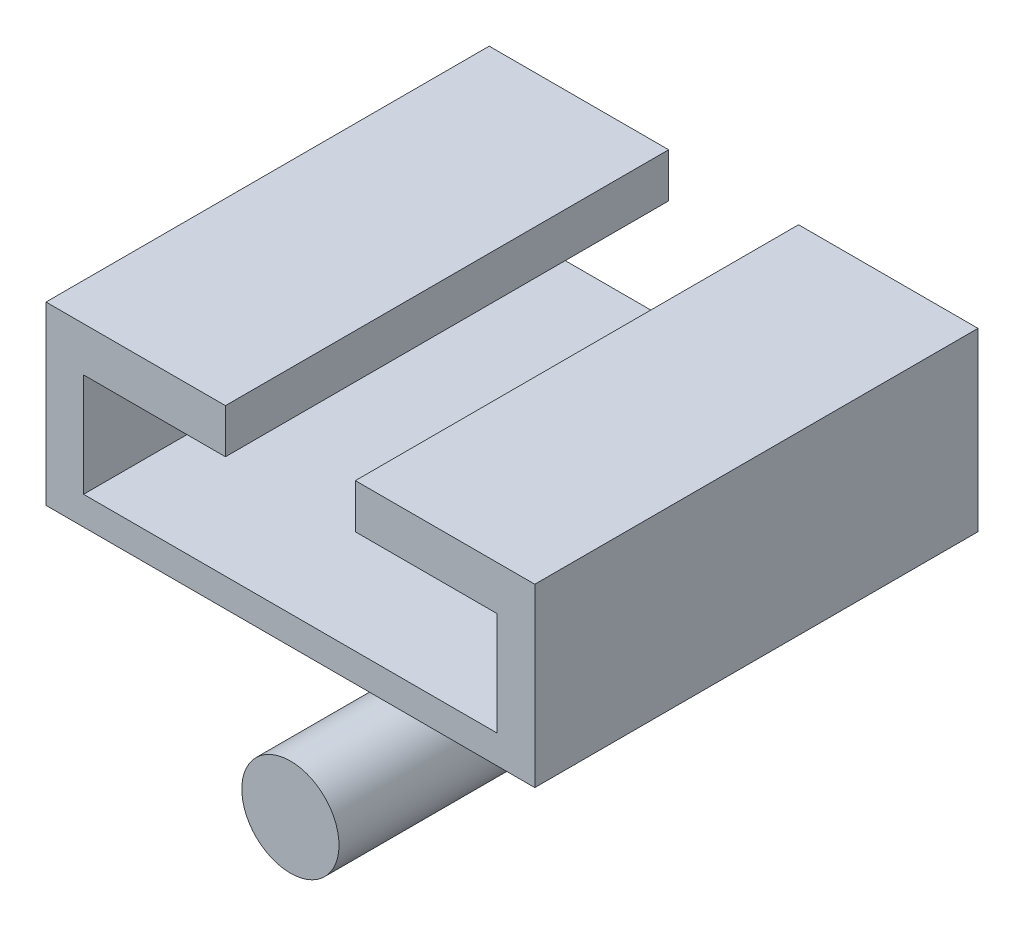
ISO-10303-21;
HEADER;
FILE_DESCRIPTION(('STEP AP214'),'2;1');
FILE_NAME('part.step','',(''),(''),'','','');
FILE_SCHEMA(('AUTOMOTIVE_DESIGN { 1 0 10303 214 1 1 1 1 }'));
ENDSEC;
DATA;
#1=APPLICATION_CONTEXT('core data for automotive mechanical design processes');
#2=APPLICATION_PROTOCOL_DEFINITION('international standard','automotive_design',2000,#1);
#3=PRODUCT_CONTEXT('',#1,'mechanical');
#4=PRODUCT('Part','Part','',(#3));
#5=PRODUCT_RELATED_PRODUCT_CATEGORY('part','',(#4));
#6=PRODUCT_DEFINITION_FORMATION('','',#4);
#7=PRODUCT_DEFINITION_CONTEXT('part definition',#1,'design');
#8=PRODUCT_DEFINITION('design','',#6,#7);
#9=PRODUCT_DEFINITION_SHAPE('','',#8);
#10=(LENGTH_UNIT() NAMED_UNIT(*) SI_UNIT(.MILLI.,.METRE.));
#11=(NAMED_UNIT(*) PLANE_ANGLE_UNIT() SI_UNIT($,.RADIAN.));
#12=(NAMED_UNIT(*) SI_UNIT($,.STERADIAN.) SOLID_ANGLE_UNIT());
#13=UNCERTAINTY_MEASURE_WITH_UNIT(LENGTH_MEASURE(1.E-05),#10,'distance_accuracy_value','');
#14=(GEOMETRIC_REPRESENTATION_CONTEXT(3) GLOBAL_UNCERTAINTY_ASSIGNED_CONTEXT((#13)) GLOBAL_UNIT_ASSIGNED_CONTEXT((#10,
#11,#12)) REPRESENTATION_CONTEXT('',''));
#15=CARTESIAN_POINT('',(0.,0.,0.));
#16=DIRECTION('',(0.,0.,1.));
#17=DIRECTION('',(1.,0.,0.));
#18=AXIS2_PLACEMENT_3D('',#15,#16,#17);
#19=CARTESIAN_POINT('',(0.,30.2840088643327,-76.2));
#20=DIRECTION('',(0.,1.,0.));
#21=DIRECTION('',(0.,0.,1.));
#22=AXIS2_PLACEMENT_3D('',#19,#20,#21);
#23=PLANE('',#22);
#24=DIRECTION('',(0.,0.,1.));
#25=VECTOR('',#24,1.);
#26=CARTESIAN_POINT('',(53.1873905490387,30.2840088643327,-76.2));
#27=LINE('',#26,#25);
#28=CARTESIAN_POINT('',(53.1873905490387,30.2840088643327,-76.2));
#29=VERTEX_POINT('',#28);
#30=CARTESIAN_POINT('',(53.1873905490387,30.2840088643327,0.));
#31=VERTEX_POINT('',#30);
#32=EDGE_CURVE('E232',#29,#31,#27,.T.);
#33=ORIENTED_EDGE('',*,*,#32,.T.);
#34=DIRECTION('',(-1.,0.,0.));
#35=VECTOR('',#34,1.);
#36=CARTESIAN_POINT('',(0.,30.2840088643327,0.));
#37=LINE('',#36,#35);
#38=CARTESIAN_POINT('',(84.0404258150022,30.2840088643327,0.));
#39=VERTEX_POINT('',#38);
#40=EDGE_CURVE('E286',#39,#31,#37,.T.);
#41=ORIENTED_EDGE('',*,*,#40,.F.);
#42=DIRECTION('',(0.,0.,1.));
#43=VECTOR('',#42,1.);
#44=CARTESIAN_POINT('',(84.0404258150022,30.2840088643327,-76.2));
#45=LINE('',#44,#43);
#46=CARTESIAN_POINT('',(84.0404258150022,30.2840088643327,-76.2));
#47=VERTEX_POINT('',#46);
#48=EDGE_CURVE('E319',#47,#39,#45,.T.);
#49=ORIENTED_EDGE('',*,*,#48,.F.);
#50=DIRECTION('',(-1.,0.,0.));
#51=VECTOR('',#50,1.);
#52=CARTESIAN_POINT('',(0.,30.2840088643327,-76.2));
#53=LINE('',#52,#51);
#54=EDGE_CURVE('E296',#47,#29,#53,.T.);
#55=ORIENTED_EDGE('',*,*,#54,.T.);
#56=EDGE_LOOP('',(#33,#41,#49,#55));
#57=FACE_BOUND('',#56,.T.);
#58=ADVANCED_FACE('F52',(#57),#23,.T.);
#59=CARTESIAN_POINT('',(0.,0.,-76.2));
#60=DIRECTION('',(-1.,0.,0.));
#61=DIRECTION('',(0.,0.,1.));
#62=AXIS2_PLACEMENT_3D('',#59,#60,#61);
#63=PLANE('',#62);
#64=DIRECTION('',(0.,-1.,0.));
#65=VECTOR('',#64,1.);
#66=CARTESIAN_POINT('',(0.,0.,0.));
#67=LINE('',#66,#65);
#68=CARTESIAN_POINT('',(0.,30.2840088643327,0.));
#69=VERTEX_POINT('',#68);
#70=CARTESIAN_POINT('',(0.,0.,0.));
#71=VERTEX_POINT('',#70);
#72=EDGE_CURVE('E260',#69,#71,#67,.T.);
#73=ORIENTED_EDGE('',*,*,#72,.F.);
#74=DIRECTION('',(0.,0.,1.));
#75=VECTOR('',#74,1.);
#76=CARTESIAN_POINT('',(0.,30.2840088643327,-76.2));
#77=LINE('',#76,#75);
#78=CARTESIAN_POINT('',(0.,30.2840088643327,-76.2));
#79=VERTEX_POINT('',#78);
#80=EDGE_CURVE('E61',#79,#69,#77,.T.);
#81=ORIENTED_EDGE('',*,*,#80,.F.);
#82=DIRECTION('',(0.,-1.,0.));
#83=VECTOR('',#82,1.);
#84=CARTESIAN_POINT('',(0.,0.,-76.2));
#85=LINE('',#84,#83);
#86=CARTESIAN_POINT('',(0.,0.,-76.2));
#87=VERTEX_POINT('',#86);
#88=EDGE_CURVE('E281',#79,#87,#85,.T.);
#89=ORIENTED_EDGE('',*,*,#88,.T.);
#90=DIRECTION('',(0.,0.,1.));
#91=VECTOR('',#90,1.);
#92=CARTESIAN_POINT('',(0.,0.,-76.2));
#93=LINE('',#92,#91);
#94=EDGE_CURVE('E300',#87,#71,#93,.T.);
#95=ORIENTED_EDGE('',*,*,#94,.T.);
#96=EDGE_LOOP('',(#73,#81,#89,#95));
#97=FACE_BOUND('',#96,.T.);
#98=ADVANCED_FACE('F54',(#97),#63,.T.);
#99=DIRECTION('',(0.,0.,1.));
#100=VECTOR('',#99,1.);
#101=CARTESIAN_POINT('',(30.8530352659635,30.2840088643327,-76.2));
#102=LINE('',#101,#100);
#103=CARTESIAN_POINT('',(30.8530352659635,30.2840088643327,-76.2));
#104=VERTEX_POINT('',#103);
#105=CARTESIAN_POINT('',(30.8530352659635,30.2840088643327,0.));
#106=VERTEX_POINT('',#105);
#107=EDGE_CURVE('E76',#104,#106,#102,.T.);
#108=ORIENTED_EDGE('',*,*,#107,.F.);
#109=EDGE_CURVE('E295',#104,#79,#53,.T.);
#110=ORIENTED_EDGE('',*,*,#109,.T.);
#111=ORIENTED_EDGE('',*,*,#80,.T.);
#112=EDGE_CURVE('E312',#106,#69,#37,.T.);
#113=ORIENTED_EDGE('',*,*,#112,.F.);
#114=EDGE_LOOP('',(#108,#110,#111,#113));
#115=FACE_BOUND('',#114,.T.);
#116=ADVANCED_FACE('F341',(#115),#23,.T.);
#117=CARTESIAN_POINT('',(84.0404258150022,0.,-76.2));
#118=DIRECTION('',(1.,0.,0.));
#119=DIRECTION('',(0.,0.,-1.));
#120=AXIS2_PLACEMENT_3D('',#117,#118,#119);
#121=PLANE('',#120);
#122=DIRECTION('',(0.,1.,0.));
#123=VECTOR('',#122,1.);
#124=CARTESIAN_POINT('',(84.0404258150022,0.,0.));
#125=LINE('',#124,#123);
#126=CARTESIAN_POINT('',(84.0404258150022,0.,0.));
#127=VERTEX_POINT('',#126);
#128=EDGE_CURVE('E308',#127,#39,#125,.T.);
#129=ORIENTED_EDGE('',*,*,#128,.F.);
#130=DIRECTION('',(0.,0.,1.));
#131=VECTOR('',#130,1.);
#132=CARTESIAN_POINT('',(84.0404258150022,0.,-76.2));
#133=LINE('',#132,#131);
#134=CARTESIAN_POINT('',(84.0404258150022,0.,-76.2));
#135=VERTEX_POINT('',#134);
#136=EDGE_CURVE('E322',#135,#127,#133,.T.);
#137=ORIENTED_EDGE('',*,*,#136,.F.);
#138=DIRECTION('',(0.,1.,0.));
#139=VECTOR('',#138,1.);
#140=CARTESIAN_POINT('',(84.0404258150022,0.,-76.2));
#141=LINE('',#140,#139);
#142=EDGE_CURVE('E291',#135,#47,#141,.T.);
#143=ORIENTED_EDGE('',*,*,#142,.T.);
#144=ORIENTED_EDGE('',*,*,#48,.T.);
#145=EDGE_LOOP('',(#129,#137,#143,#144));
#146=FACE_BOUND('',#145,.T.);
#147=ADVANCED_FACE('F382',(#146),#121,.T.);
#148=CARTESIAN_POINT('',(0.,0.,-76.2));
#149=DIRECTION('',(0.,-1.,0.));
#150=DIRECTION('',(0.,0.,-1.));
#151=AXIS2_PLACEMENT_3D('',#148,#149,#150);
#152=PLANE('',#151);
#153=DIRECTION('',(0.,0.,-1.));
#154=VECTOR('',#153,1.);
#155=CARTESIAN_POINT('',(33.6617496424714,0.,-69.85));
#156=LINE('',#155,#154);
#157=CARTESIAN_POINT('',(33.6617496424714,0.,-69.85));
#158=VERTEX_POINT('',#157);
#159=CARTESIAN_POINT('',(33.6617496424714,0.,-76.2));
#160=VERTEX_POINT('',#159);
#161=EDGE_CURVE('E179',#158,#160,#156,.T.);
#162=ORIENTED_EDGE('',*,*,#161,.F.);
#163=DIRECTION('',(-1.,0.,0.));
#164=VECTOR('',#163,1.);
#165=CARTESIAN_POINT('',(33.6617496424714,0.,-69.85));
#166=LINE('',#165,#164);
#167=CARTESIAN_POINT('',(50.3786761725308,0.,-69.85));
#168=VERTEX_POINT('',#167);
#169=EDGE_CURVE('E186',#168,#158,#166,.T.);
#170=ORIENTED_EDGE('',*,*,#169,.F.);
#171=DIRECTION('',(0.,0.,-1.));
#172=VECTOR('',#171,1.);
#173=CARTESIAN_POINT('',(50.3786761725308,0.,-69.85));
#174=LINE('',#173,#172);
#175=CARTESIAN_POINT('',(50.3786761725308,0.,-76.2));
#176=VERTEX_POINT('',#175);
#177=EDGE_CURVE('E199',#168,#176,#174,.T.);
#178=ORIENTED_EDGE('',*,*,#177,.T.);
#179=DIRECTION('',(1.,0.,0.));
#180=VECTOR('',#179,1.);
#181=CARTESIAN_POINT('',(0.,0.,-76.2));
#182=LINE('',#181,#180);
#183=EDGE_CURVE('E285',#176,#135,#182,.T.);
#184=ORIENTED_EDGE('',*,*,#183,.T.);
#185=ORIENTED_EDGE('',*,*,#136,.T.);
#186=DIRECTION('',(1.,0.,0.));
#187=VECTOR('',#186,1.);
#188=CARTESIAN_POINT('',(0.,0.,0.));
#189=LINE('',#188,#187);
#190=EDGE_CURVE('E304',#71,#127,#189,.T.);
#191=ORIENTED_EDGE('',*,*,#190,.F.);
#192=ORIENTED_EDGE('',*,*,#94,.F.);
#193=EDGE_CURVE('E287',#87,#160,#182,.T.);
#194=ORIENTED_EDGE('',*,*,#193,.T.);
#195=EDGE_LOOP('',(#162,#170,#178,#184,#185,#191,#192,#194));
#196=FACE_BOUND('',#195,.T.);
#197=ADVANCED_FACE('F332',(#196),#152,.T.);
#198=CARTESIAN_POINT('',(0.,0.,-76.2));
#199=DIRECTION('',(0.,0.,-1.));
#200=DIRECTION('',(-1.,0.,0.));
#201=AXIS2_PLACEMENT_3D('',#198,#199,#200);
#202=PLANE('',#201);
#203=DIRECTION('',(0.,1.,0.));
#204=VECTOR('',#203,1.);
#205=CARTESIAN_POINT('',(50.3786761725308,0.,-76.2));
#206=LINE('',#205,#204);
#207=CARTESIAN_POINT('',(50.3786761725308,-25.4,-76.2));
#208=VERTEX_POINT('',#207);
#209=EDGE_CURVE('E68',#208,#176,#206,.T.);
#210=ORIENTED_EDGE('',*,*,#209,.F.);
#211=CARTESIAN_POINT('',(42.0202129075011,-25.4,-76.2));
#212=DIRECTION('',(0.,0.,1.));
#213=DIRECTION('',(1.,0.,0.));
#214=AXIS2_PLACEMENT_3D('',#211,#212,#213);
#215=CIRCLE('',#214,8.35846326502969);
#216=CARTESIAN_POINT('',(33.6617496424714,-25.4,-76.2));
#217=VERTEX_POINT('',#216);
#218=EDGE_CURVE('E191',#217,#208,#215,.T.);
#219=ORIENTED_EDGE('',*,*,#218,.F.);
#220=DIRECTION('',(0.,-1.,0.));
#221=VECTOR('',#220,1.);
#222=CARTESIAN_POINT('',(33.6617496424714,0.,-76.2));
#223=LINE('',#222,#221);
#224=EDGE_CURVE('E174',#160,#217,#223,.T.);
#225=ORIENTED_EDGE('',*,*,#224,.F.);
#226=ORIENTED_EDGE('',*,*,#193,.F.);
#227=ORIENTED_EDGE('',*,*,#88,.F.);
#228=ORIENTED_EDGE('',*,*,#109,.F.);
#229=DIRECTION('',(0.,-1.,0.));
#230=VECTOR('',#229,1.);
#231=CARTESIAN_POINT('',(30.8530352659635,30.2840088643327,-76.2));
#232=LINE('',#231,#230);
#233=CARTESIAN_POINT('',(30.8530352659635,22.6640088643327,-76.2));
#234=VERTEX_POINT('',#233);
#235=EDGE_CURVE('E207',#104,#234,#232,.T.);
#236=ORIENTED_EDGE('',*,*,#235,.T.);
#237=DIRECTION('',(-1.,0.,0.));
#238=VECTOR('',#237,1.);
#239=CARTESIAN_POINT('',(30.8530352659635,22.6640088643327,-76.2));
#240=LINE('',#239,#238);
#241=CARTESIAN_POINT('',(6.46021290750111,22.6640088643327,-76.2));
#242=VERTEX_POINT('',#241);
#243=EDGE_CURVE('E212',#234,#242,#240,.T.);
#244=ORIENTED_EDGE('',*,*,#243,.T.);
#245=DIRECTION('',(0.,-1.,0.));
#246=VECTOR('',#245,1.);
#247=CARTESIAN_POINT('',(6.46021290750111,22.6640088643327,-76.2));
#248=LINE('',#247,#246);
#249=CARTESIAN_POINT('',(6.46021290750111,4.88400886433269,-76.2));
#250=VERTEX_POINT('',#249);
#251=EDGE_CURVE('E216',#242,#250,#248,.T.);
#252=ORIENTED_EDGE('',*,*,#251,.T.);
#253=DIRECTION('',(1.,0.,0.));
#254=VECTOR('',#253,1.);
#255=CARTESIAN_POINT('',(77.5802129075011,4.88400886433269,-76.2));
#256=LINE('',#255,#254);
#257=CARTESIAN_POINT('',(77.5802129075011,4.88400886433269,-76.2));
#258=VERTEX_POINT('',#257);
#259=EDGE_CURVE('E220',#250,#258,#256,.T.);
#260=ORIENTED_EDGE('',*,*,#259,.T.);
#261=DIRECTION('',(0.,1.,0.));
#262=VECTOR('',#261,1.);
#263=CARTESIAN_POINT('',(77.5802129075011,22.6640088643327,-76.2));
#264=LINE('',#263,#262);
#265=CARTESIAN_POINT('',(77.5802129075011,22.6640088643327,-76.2));
#266=VERTEX_POINT('',#265);
#267=EDGE_CURVE('E224',#258,#266,#264,.T.);
#268=ORIENTED_EDGE('',*,*,#267,.T.);
#269=DIRECTION('',(-1.,0.,0.));
#270=VECTOR('',#269,1.);
#271=CARTESIAN_POINT('',(53.1873905490387,22.6640088643327,-76.2));
#272=LINE('',#271,#270);
#273=CARTESIAN_POINT('',(53.1873905490387,22.6640088643327,-76.2));
#274=VERTEX_POINT('',#273);
#275=EDGE_CURVE('E228',#266,#274,#272,.T.);
#276=ORIENTED_EDGE('',*,*,#275,.T.);
#277=DIRECTION('',(0.,1.,0.));
#278=VECTOR('',#277,1.);
#279=CARTESIAN_POINT('',(53.1873905490387,30.2840088643327,-76.2));
#280=LINE('',#279,#278);
#281=EDGE_CURVE('E203',#274,#29,#280,.T.);
#282=ORIENTED_EDGE('',*,*,#281,.T.);
#283=ORIENTED_EDGE('',*,*,#54,.F.);
#284=ORIENTED_EDGE('',*,*,#142,.F.);
#285=ORIENTED_EDGE('',*,*,#183,.F.);
#286=EDGE_LOOP('',(#210,#219,#225,#226,#227,#228,#236,#244,#252,#260,#268,#276,#282,#283,#284,#285));
#287=FACE_BOUND('',#286,.T.);
#288=ADVANCED_FACE('F344',(#287),#202,.T.);
#289=CARTESIAN_POINT('',(0.,0.,0.));
#290=DIRECTION('',(0.,0.,-1.));
#291=DIRECTION('',(-1.,0.,0.));
#292=AXIS2_PLACEMENT_3D('',#289,#290,#291);
#293=PLANE('',#292);
#294=ORIENTED_EDGE('',*,*,#40,.T.);
#295=DIRECTION('',(0.,1.,0.));
#296=VECTOR('',#295,1.);
#297=CARTESIAN_POINT('',(53.1873905490387,30.2840088643327,0.));
#298=LINE('',#297,#296);
#299=CARTESIAN_POINT('',(53.1873905490387,22.6640088643327,0.));
#300=VERTEX_POINT('',#299);
#301=EDGE_CURVE('E202',#300,#31,#298,.T.);
#302=ORIENTED_EDGE('',*,*,#301,.F.);
#303=DIRECTION('',(-1.,0.,0.));
#304=VECTOR('',#303,1.);
#305=CARTESIAN_POINT('',(53.1873905490387,22.6640088643327,0.));
#306=LINE('',#305,#304);
#307=CARTESIAN_POINT('',(77.5802129075011,22.6640088643327,0.));
#308=VERTEX_POINT('',#307);
#309=EDGE_CURVE('E208',#308,#300,#306,.T.);
#310=ORIENTED_EDGE('',*,*,#309,.F.);
#311=DIRECTION('',(0.,1.,0.));
#312=VECTOR('',#311,1.);
#313=CARTESIAN_POINT('',(77.5802129075011,22.6640088643327,0.));
#314=LINE('',#313,#312);
#315=CARTESIAN_POINT('',(77.5802129075011,4.88400886433269,0.));
#316=VERTEX_POINT('',#315);
#317=EDGE_CURVE('E250',#316,#308,#314,.T.);
#318=ORIENTED_EDGE('',*,*,#317,.F.);
#319=DIRECTION('',(1.,0.,0.));
#320=VECTOR('',#319,1.);
#321=CARTESIAN_POINT('',(77.5802129075011,4.88400886433269,0.));
#322=LINE('',#321,#320);
#323=CARTESIAN_POINT('',(6.46021290750111,4.88400886433269,0.));
#324=VERTEX_POINT('',#323);
#325=EDGE_CURVE('E245',#324,#316,#322,.T.);
#326=ORIENTED_EDGE('',*,*,#325,.F.);
#327=DIRECTION('',(0.,-1.,0.));
#328=VECTOR('',#327,1.);
#329=CARTESIAN_POINT('',(6.46021290750111,22.6640088643327,0.));
#330=LINE('',#329,#328);
#331=CARTESIAN_POINT('',(6.46021290750111,22.6640088643327,0.));
#332=VERTEX_POINT('',#331);
#333=EDGE_CURVE('E242',#332,#324,#330,.T.);
#334=ORIENTED_EDGE('',*,*,#333,.F.);
#335=DIRECTION('',(-1.,0.,0.));
#336=VECTOR('',#335,1.);
#337=CARTESIAN_POINT('',(30.8530352659635,22.6640088643327,0.));
#338=LINE('',#337,#336);
#339=CARTESIAN_POINT('',(30.8530352659635,22.6640088643327,0.));
#340=VERTEX_POINT('',#339);
#341=EDGE_CURVE('E238',#340,#332,#338,.T.);
#342=ORIENTED_EDGE('',*,*,#341,.F.);
#343=DIRECTION('',(0.,-1.,0.));
#344=VECTOR('',#343,1.);
#345=CARTESIAN_POINT('',(30.8530352659635,30.2840088643327,0.));
#346=LINE('',#345,#344);
#347=EDGE_CURVE('E235',#106,#340,#346,.T.);
#348=ORIENTED_EDGE('',*,*,#347,.F.);
#349=ORIENTED_EDGE('',*,*,#112,.T.);
#350=ORIENTED_EDGE('',*,*,#72,.T.);
#351=ORIENTED_EDGE('',*,*,#190,.T.);
#352=ORIENTED_EDGE('',*,*,#128,.T.);
#353=EDGE_LOOP('',(#294,#302,#310,#318,#326,#334,#342,#348,#349,#350,#351,#352));
#354=FACE_BOUND('',#353,.T.);
#355=ADVANCED_FACE('F336',(#354),#293,.F.);
#356=CARTESIAN_POINT('',(53.1873905490387,30.2840088643327,-76.2));
#357=DIRECTION('',(1.,0.,0.));
#358=DIRECTION('',(0.,0.,-1.));
#359=AXIS2_PLACEMENT_3D('',#356,#357,#358);
#360=PLANE('',#359);
#361=ORIENTED_EDGE('',*,*,#301,.T.);
#362=ORIENTED_EDGE('',*,*,#32,.F.);
#363=ORIENTED_EDGE('',*,*,#281,.F.);
#364=DIRECTION('',(0.,0.,1.));
#365=VECTOR('',#364,1.);
#366=CARTESIAN_POINT('',(53.1873905490387,22.6640088643327,-76.2));
#367=LINE('',#366,#365);
#368=EDGE_CURVE('E257',#274,#300,#367,.T.);
#369=ORIENTED_EDGE('',*,*,#368,.T.);
#370=EDGE_LOOP('',(#361,#362,#363,#369));
#371=FACE_BOUND('',#370,.T.);
#372=ADVANCED_FACE('F396',(#371),#360,.F.);
#373=CARTESIAN_POINT('',(53.1873905490387,22.6640088643327,-76.2));
#374=DIRECTION('',(0.,1.,0.));
#375=DIRECTION('',(0.,0.,1.));
#376=AXIS2_PLACEMENT_3D('',#373,#374,#375);
#377=PLANE('',#376);
#378=ORIENTED_EDGE('',*,*,#309,.T.);
#379=ORIENTED_EDGE('',*,*,#368,.F.);
#380=ORIENTED_EDGE('',*,*,#275,.F.);
#381=DIRECTION('',(0.,0.,1.));
#382=VECTOR('',#381,1.);
#383=CARTESIAN_POINT('',(77.5802129075011,22.6640088643327,-76.2));
#384=LINE('',#383,#382);
#385=EDGE_CURVE('E261',#266,#308,#384,.T.);
#386=ORIENTED_EDGE('',*,*,#385,.T.);
#387=EDGE_LOOP('',(#378,#379,#380,#386));
#388=FACE_BOUND('',#387,.T.);
#389=ADVANCED_FACE('F400',(#388),#377,.F.);
#390=CARTESIAN_POINT('',(77.5802129075011,22.6640088643327,-76.2));
#391=DIRECTION('',(1.,0.,0.));
#392=DIRECTION('',(0.,0.,-1.));
#393=AXIS2_PLACEMENT_3D('',#390,#391,#392);
#394=PLANE('',#393);
#395=ORIENTED_EDGE('',*,*,#317,.T.);
#396=ORIENTED_EDGE('',*,*,#385,.F.);
#397=ORIENTED_EDGE('',*,*,#267,.F.);
#398=DIRECTION('',(0.,0.,1.));
#399=VECTOR('',#398,1.);
#400=CARTESIAN_POINT('',(77.5802129075011,4.88400886433269,-76.2));
#401=LINE('',#400,#399);
#402=EDGE_CURVE('E264',#258,#316,#401,.T.);
#403=ORIENTED_EDGE('',*,*,#402,.T.);
#404=EDGE_LOOP('',(#395,#396,#397,#403));
#405=FACE_BOUND('',#404,.T.);
#406=ADVANCED_FACE('F406',(#405),#394,.F.);
#407=CARTESIAN_POINT('',(77.5802129075011,4.88400886433269,-76.2));
#408=DIRECTION('',(0.,-1.,0.));
#409=DIRECTION('',(0.,0.,-1.));
#410=AXIS2_PLACEMENT_3D('',#407,#408,#409);
#411=PLANE('',#410);
#412=ORIENTED_EDGE('',*,*,#325,.T.);
#413=ORIENTED_EDGE('',*,*,#402,.F.);
#414=ORIENTED_EDGE('',*,*,#259,.F.);
#415=DIRECTION('',(0.,0.,1.));
#416=VECTOR('',#415,1.);
#417=CARTESIAN_POINT('',(6.46021290750111,4.88400886433269,-76.2));
#418=LINE('',#417,#416);
#419=EDGE_CURVE('E267',#250,#324,#418,.T.);
#420=ORIENTED_EDGE('',*,*,#419,.T.);
#421=EDGE_LOOP('',(#412,#413,#414,#420));
#422=FACE_BOUND('',#421,.T.);
#423=ADVANCED_FACE('F409',(#422),#411,.F.);
#424=CARTESIAN_POINT('',(6.46021290750111,22.6640088643327,-76.2));
#425=DIRECTION('',(-1.,0.,0.));
#426=DIRECTION('',(0.,0.,1.));
#427=AXIS2_PLACEMENT_3D('',#424,#425,#426);
#428=PLANE('',#427);
#429=ORIENTED_EDGE('',*,*,#333,.T.);
#430=ORIENTED_EDGE('',*,*,#419,.F.);
#431=ORIENTED_EDGE('',*,*,#251,.F.);
#432=DIRECTION('',(0.,0.,1.));
#433=VECTOR('',#432,1.);
#434=CARTESIAN_POINT('',(6.46021290750111,22.6640088643327,-76.2));
#435=LINE('',#434,#433);
#436=EDGE_CURVE('E270',#242,#332,#435,.T.);
#437=ORIENTED_EDGE('',*,*,#436,.T.);
#438=EDGE_LOOP('',(#429,#430,#431,#437));
#439=FACE_BOUND('',#438,.T.);
#440=ADVANCED_FACE('F412',(#439),#428,.F.);
#441=CARTESIAN_POINT('',(30.8530352659635,22.6640088643327,-76.2));
#442=DIRECTION('',(0.,1.,0.));
#443=DIRECTION('',(0.,0.,1.));
#444=AXIS2_PLACEMENT_3D('',#441,#442,#443);
#445=PLANE('',#444);
#446=ORIENTED_EDGE('',*,*,#341,.T.);
#447=ORIENTED_EDGE('',*,*,#436,.F.);
#448=ORIENTED_EDGE('',*,*,#243,.F.);
#449=DIRECTION('',(0.,0.,1.));
#450=VECTOR('',#449,1.);
#451=CARTESIAN_POINT('',(30.8530352659635,22.6640088643327,-76.2));
#452=LINE('',#451,#450);
#453=EDGE_CURVE('E273',#234,#340,#452,.T.);
#454=ORIENTED_EDGE('',*,*,#453,.T.);
#455=EDGE_LOOP('',(#446,#447,#448,#454));
#456=FACE_BOUND('',#455,.T.);
#457=ADVANCED_FACE('F414',(#456),#445,.F.);
#458=CARTESIAN_POINT('',(30.8530352659635,30.2840088643327,-76.2));
#459=DIRECTION('',(-1.,0.,0.));
#460=DIRECTION('',(0.,0.,1.));
#461=AXIS2_PLACEMENT_3D('',#458,#459,#460);
#462=PLANE('',#461);
#463=ORIENTED_EDGE('',*,*,#347,.T.);
#464=ORIENTED_EDGE('',*,*,#453,.F.);
#465=ORIENTED_EDGE('',*,*,#235,.F.);
#466=ORIENTED_EDGE('',*,*,#107,.T.);
#467=EDGE_LOOP('',(#463,#464,#465,#466));
#468=FACE_BOUND('',#467,.T.);
#469=ADVANCED_FACE('F416',(#468),#462,.F.);
#470=CARTESIAN_POINT('',(50.3786761725308,0.,-69.85));
#471=DIRECTION('',(-1.,0.,0.));
#472=DIRECTION('',(0.,0.,1.));
#473=AXIS2_PLACEMENT_3D('',#470,#471,#472);
#474=PLANE('',#473);
#475=ORIENTED_EDGE('',*,*,#209,.T.);
#476=ORIENTED_EDGE('',*,*,#177,.F.);
#477=DIRECTION('',(0.,1.,0.));
#478=VECTOR('',#477,1.);
#479=CARTESIAN_POINT('',(50.3786761725308,0.,-69.85));
#480=LINE('',#479,#478);
#481=CARTESIAN_POINT('',(50.3786761725308,-25.4,-69.85));
#482=VERTEX_POINT('',#481);
#483=EDGE_CURVE('E347',#482,#168,#480,.T.);
#484=ORIENTED_EDGE('',*,*,#483,.F.);
#485=DIRECTION('',(0.,0.,-1.));
#486=VECTOR('',#485,1.);
#487=CARTESIAN_POINT('',(50.3786761725308,-25.4,-69.85));
#488=LINE('',#487,#486);
#489=EDGE_CURVE('E180',#482,#208,#488,.T.);
#490=ORIENTED_EDGE('',*,*,#489,.T.);
#491=EDGE_LOOP('',(#475,#476,#484,#490));
#492=FACE_BOUND('',#491,.T.);
#493=ADVANCED_FACE('F418',(#492),#474,.F.);
#494=CARTESIAN_POINT('',(33.6617496424714,0.,-69.85));
#495=DIRECTION('',(1.,0.,0.));
#496=DIRECTION('',(0.,0.,-1.));
#497=AXIS2_PLACEMENT_3D('',#494,#495,#496);
#498=PLANE('',#497);
#499=ORIENTED_EDGE('',*,*,#224,.T.);
#500=DIRECTION('',(0.,0.,-1.));
#501=VECTOR('',#500,1.);
#502=CARTESIAN_POINT('',(33.6617496424714,-25.4,-69.85));
#503=LINE('',#502,#501);
#504=CARTESIAN_POINT('',(33.6617496424714,-25.4,-69.85));
#505=VERTEX_POINT('',#504);
#506=EDGE_CURVE('E168',#505,#217,#503,.T.);
#507=ORIENTED_EDGE('',*,*,#506,.F.);
#508=DIRECTION('',(0.,-1.,0.));
#509=VECTOR('',#508,1.);
#510=CARTESIAN_POINT('',(33.6617496424714,0.,-69.85));
#511=LINE('',#510,#509);
#512=EDGE_CURVE('E171',#158,#505,#511,.T.);
#513=ORIENTED_EDGE('',*,*,#512,.F.);
#514=ORIENTED_EDGE('',*,*,#161,.T.);
#515=EDGE_LOOP('',(#499,#507,#513,#514));
#516=FACE_BOUND('',#515,.T.);
#517=ADVANCED_FACE('F170',(#516),#498,.F.);
#518=CARTESIAN_POINT('',(0.,0.,-69.85));
#519=DIRECTION('',(0.,0.,-1.));
#520=DIRECTION('',(-1.,0.,0.));
#521=AXIS2_PLACEMENT_3D('',#518,#519,#520);
#522=PLANE('',#521);
#523=CARTESIAN_POINT('',(42.0202129075011,-25.4,-69.85));
#524=DIRECTION('',(0.,0.,-1.));
#525=DIRECTION('',(-1.,0.,0.));
#526=AXIS2_PLACEMENT_3D('',#523,#524,#525);
#527=CIRCLE('',#526,8.35846326502969);
#528=EDGE_CURVE('E12',#482,#505,#527,.F.);
#529=ORIENTED_EDGE('',*,*,#528,.F.);
#530=ORIENTED_EDGE('',*,*,#483,.T.);
#531=ORIENTED_EDGE('',*,*,#169,.T.);
#532=ORIENTED_EDGE('',*,*,#512,.T.);
#533=EDGE_LOOP('',(#529,#530,#531,#532));
#534=FACE_BOUND('',#533,.T.);
#535=ADVANCED_FACE('F183',(#534),#522,.F.);
#536=CARTESIAN_POINT('',(42.0202129075011,-25.4,0.));
#537=DIRECTION('',(0.,0.,-1.));
#538=DIRECTION('',(-1.,0.,0.));
#539=AXIS2_PLACEMENT_3D('',#536,#537,#538);
#540=CYLINDRICAL_SURFACE('',#539,8.35846326502969);
#541=CARTESIAN_POINT('',(42.0202129075011,-25.4,0.));
#542=DIRECTION('',(0.,0.,1.));
#543=DIRECTION('',(1.,0.,0.));
#544=AXIS2_PLACEMENT_3D('',#541,#542,#543);
#545=CIRCLE('',#544,8.35846326502969);
#546=CARTESIAN_POINT('',(50.3786761725308,-25.4,0.));
#547=VERTEX_POINT('',#546);
#548=EDGE_CURVE('E354',#547,#547,#545,.T.);
#549=ORIENTED_EDGE('',*,*,#548,.F.);
#550=EDGE_LOOP('',(#549));
#551=FACE_BOUND('',#550,.T.);
#552=ORIENTED_EDGE('',*,*,#218,.T.);
#553=ORIENTED_EDGE('',*,*,#489,.F.);
#554=ORIENTED_EDGE('',*,*,#528,.T.);
#555=ORIENTED_EDGE('',*,*,#506,.T.);
#556=EDGE_LOOP('',(#552,#553,#554,#555));
#557=FACE_BOUND('',#556,.T.);
#558=ADVANCED_FACE('F190',(#551,#557),#540,.T.);
#559=CARTESIAN_POINT('',(42.0202129075011,-25.4,0.));
#560=DIRECTION('',(0.,0.,1.));
#561=DIRECTION('',(1.,0.,0.));
#562=AXIS2_PLACEMENT_3D('',#559,#560,#561);
#563=PLANE('',#562);
#564=ORIENTED_EDGE('',*,*,#548,.T.);
#565=EDGE_LOOP('',(#564));
#566=FACE_BOUND('',#565,.T.);
#567=ADVANCED_FACE('F362',(#566),#563,.T.);
#568=CLOSED_SHELL('',(#58,#98,#116,#147,#197,#288,#355,#372,#389,#406,#423,#440,#457,#469,#493,
#517,#535,#558,#567));
#569=MANIFOLD_SOLID_BREP('B2',#568);
#570=ADVANCED_BREP_SHAPE_REPRESENTATION('',(#18,#569),#14);
#571=SHAPE_DEFINITION_REPRESENTATION(#9,#570);
ENDSEC;
END-ISO-10303-21;
